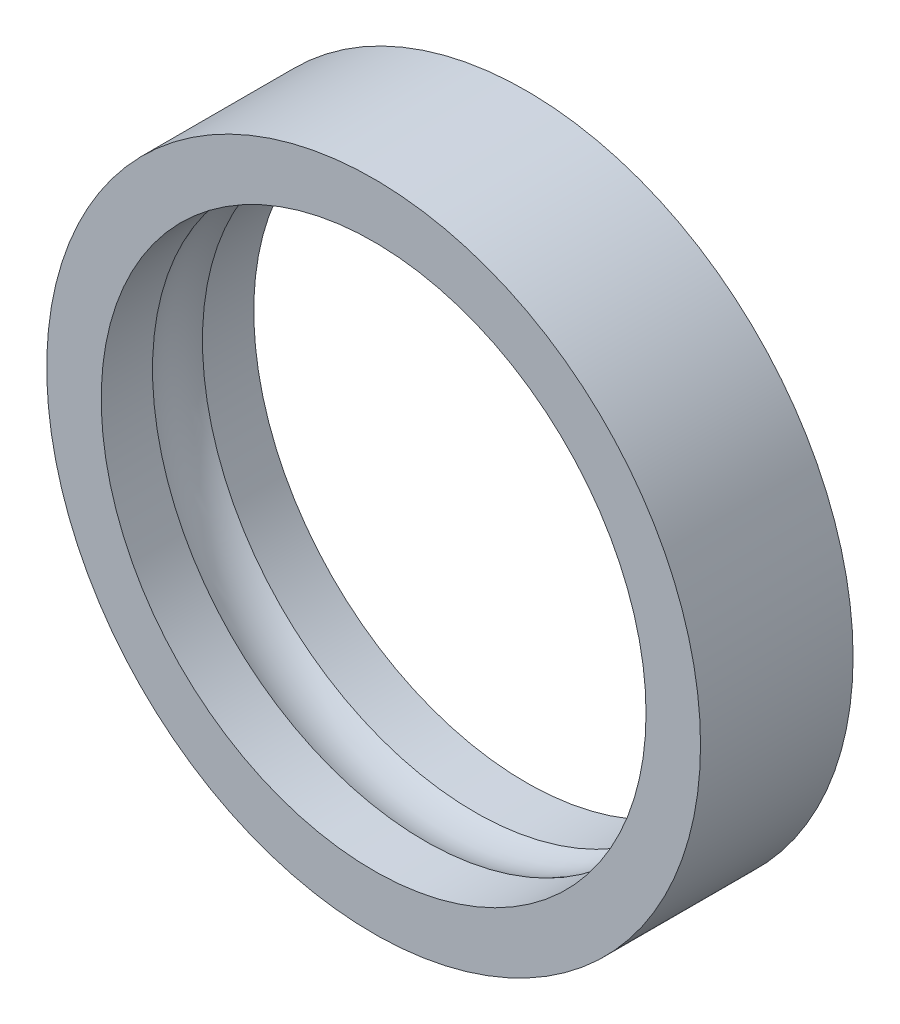
ISO-10303-21;
HEADER;
FILE_DESCRIPTION(('STEP AP214'),'2;1');
FILE_NAME('part.step','',(''),(''),'','','');
FILE_SCHEMA(('AUTOMOTIVE_DESIGN { 1 0 10303 214 1 1 1 1 }'));
ENDSEC;
DATA;
#1=APPLICATION_CONTEXT('core data for automotive mechanical design processes');
#2=APPLICATION_PROTOCOL_DEFINITION('international standard','automotive_design',2000,#1);
#3=PRODUCT_CONTEXT('',#1,'mechanical');
#4=PRODUCT('Part','Part','',(#3));
#5=PRODUCT_RELATED_PRODUCT_CATEGORY('part','',(#4));
#6=PRODUCT_DEFINITION_FORMATION('','',#4);
#7=PRODUCT_DEFINITION_CONTEXT('part definition',#1,'design');
#8=PRODUCT_DEFINITION('design','',#6,#7);
#9=PRODUCT_DEFINITION_SHAPE('','',#8);
#10=(LENGTH_UNIT() NAMED_UNIT(*) SI_UNIT(.MILLI.,.METRE.));
#11=(NAMED_UNIT(*) PLANE_ANGLE_UNIT() SI_UNIT($,.RADIAN.));
#12=(NAMED_UNIT(*) SI_UNIT($,.STERADIAN.) SOLID_ANGLE_UNIT());
#13=UNCERTAINTY_MEASURE_WITH_UNIT(LENGTH_MEASURE(1.E-05),#10,'distance_accuracy_value','');
#14=(GEOMETRIC_REPRESENTATION_CONTEXT(3) GLOBAL_UNCERTAINTY_ASSIGNED_CONTEXT((#13)) GLOBAL_UNIT_ASSIGNED_CONTEXT((#10,
#11,#12)) REPRESENTATION_CONTEXT('',''));
#15=CARTESIAN_POINT('',(0.,0.,0.));
#16=DIRECTION('',(0.,0.,1.));
#17=DIRECTION('',(1.,0.,0.));
#18=AXIS2_PLACEMENT_3D('',#15,#16,#17);
#19=CARTESIAN_POINT('',(0.,0.,0.));
#20=DIRECTION('',(0.,0.,1.));
#21=DIRECTION('',(1.,0.,0.));
#22=AXIS2_PLACEMENT_3D('',#19,#20,#21);
#23=TOROIDAL_SURFACE('',#22,20.,5.5);
#24=CARTESIAN_POINT('',(0.,0.,2.29128784747792));
#25=DIRECTION('',(0.,0.,1.));
#26=DIRECTION('',(1.,0.,0.));
#27=AXIS2_PLACEMENT_3D('',#24,#25,#26);
#28=CIRCLE('',#27,25.);
#29=CARTESIAN_POINT('',(25.,0.,2.29128784747792));
#30=VERTEX_POINT('',#29);
#31=EDGE_CURVE('E37',#30,#30,#28,.T.);
#32=ORIENTED_EDGE('',*,*,#31,.T.);
#33=EDGE_LOOP('',(#32));
#34=FACE_BOUND('',#33,.T.);
#35=CARTESIAN_POINT('',(0.,0.,-2.29128784747792));
#36=DIRECTION('',(0.,0.,1.));
#37=DIRECTION('',(1.,0.,0.));
#38=AXIS2_PLACEMENT_3D('',#35,#36,#37);
#39=CIRCLE('',#38,25.);
#40=CARTESIAN_POINT('',(25.,0.,-2.29128784747792));
#41=VERTEX_POINT('',#40);
#42=EDGE_CURVE('E31',#41,#41,#39,.F.);
#43=ORIENTED_EDGE('',*,*,#42,.T.);
#44=EDGE_LOOP('',(#43));
#45=FACE_BOUND('',#44,.T.);
#46=ADVANCED_FACE('F15',(#34,#45),#23,.F.);
#47=CARTESIAN_POINT('',(0.,0.,-7.));
#48=DIRECTION('',(0.,0.,1.));
#49=DIRECTION('',(1.,0.,0.));
#50=AXIS2_PLACEMENT_3D('',#47,#48,#49);
#51=CYLINDRICAL_SURFACE('',#50,25.);
#52=CARTESIAN_POINT('',(0.,0.,-7.));
#53=DIRECTION('',(0.,0.,1.));
#54=DIRECTION('',(1.,0.,0.));
#55=AXIS2_PLACEMENT_3D('',#52,#53,#54);
#56=CIRCLE('',#55,25.);
#57=CARTESIAN_POINT('',(25.,0.,-7.));
#58=VERTEX_POINT('',#57);
#59=EDGE_CURVE('E19',#58,#58,#56,.F.);
#60=ORIENTED_EDGE('',*,*,#59,.T.);
#61=EDGE_LOOP('',(#60));
#62=FACE_BOUND('',#61,.T.);
#63=ORIENTED_EDGE('',*,*,#42,.F.);
#64=EDGE_LOOP('',(#63));
#65=FACE_BOUND('',#64,.T.);
#66=ADVANCED_FACE('F48',(#62,#65),#51,.F.);
#67=CARTESIAN_POINT('',(0.,0.,-7.));
#68=DIRECTION('',(0.,0.,1.));
#69=DIRECTION('',(1.,0.,0.));
#70=AXIS2_PLACEMENT_3D('',#67,#68,#69);
#71=CYLINDRICAL_SURFACE('',#70,25.);
#72=CARTESIAN_POINT('',(0.,0.,7.));
#73=DIRECTION('',(0.,0.,1.));
#74=DIRECTION('',(1.,0.,0.));
#75=AXIS2_PLACEMENT_3D('',#72,#73,#74);
#76=CIRCLE('',#75,25.);
#77=CARTESIAN_POINT('',(25.,0.,7.));
#78=VERTEX_POINT('',#77);
#79=EDGE_CURVE('E28',#78,#78,#76,.F.);
#80=ORIENTED_EDGE('',*,*,#79,.F.);
#81=EDGE_LOOP('',(#80));
#82=FACE_BOUND('',#81,.T.);
#83=ORIENTED_EDGE('',*,*,#31,.F.);
#84=EDGE_LOOP('',(#83));
#85=FACE_BOUND('',#84,.T.);
#86=ADVANCED_FACE('F50',(#82,#85),#71,.F.);
#87=CARTESIAN_POINT('',(0.,0.,-7.));
#88=DIRECTION('',(0.,0.,1.));
#89=DIRECTION('',(1.,0.,0.));
#90=AXIS2_PLACEMENT_3D('',#87,#88,#89);
#91=PLANE('',#90);
#92=CARTESIAN_POINT('',(0.,0.,-7.));
#93=DIRECTION('',(0.,0.,1.));
#94=DIRECTION('',(1.,0.,0.));
#95=AXIS2_PLACEMENT_3D('',#92,#93,#94);
#96=CIRCLE('',#95,30.);
#97=CARTESIAN_POINT('',(30.,0.,-7.));
#98=VERTEX_POINT('',#97);
#99=EDGE_CURVE('E23',#98,#98,#96,.T.);
#100=ORIENTED_EDGE('',*,*,#99,.F.);
#101=EDGE_LOOP('',(#100));
#102=FACE_BOUND('',#101,.T.);
#103=ORIENTED_EDGE('',*,*,#59,.F.);
#104=EDGE_LOOP('',(#103));
#105=FACE_BOUND('',#104,.T.);
#106=ADVANCED_FACE('F56',(#102,#105),#91,.F.);
#107=CARTESIAN_POINT('',(0.,0.,7.));
#108=DIRECTION('',(0.,0.,1.));
#109=DIRECTION('',(1.,0.,0.));
#110=AXIS2_PLACEMENT_3D('',#107,#108,#109);
#111=PLANE('',#110);
#112=ORIENTED_EDGE('',*,*,#79,.T.);
#113=EDGE_LOOP('',(#112));
#114=FACE_BOUND('',#113,.T.);
#115=CARTESIAN_POINT('',(0.,0.,7.));
#116=DIRECTION('',(0.,0.,1.));
#117=DIRECTION('',(1.,0.,0.));
#118=AXIS2_PLACEMENT_3D('',#115,#116,#117);
#119=CIRCLE('',#118,30.);
#120=CARTESIAN_POINT('',(30.,0.,7.));
#121=VERTEX_POINT('',#120);
#122=EDGE_CURVE('E10',#121,#121,#119,.F.);
#123=ORIENTED_EDGE('',*,*,#122,.F.);
#124=EDGE_LOOP('',(#123));
#125=FACE_BOUND('',#124,.T.);
#126=ADVANCED_FACE('F61',(#114,#125),#111,.T.);
#127=CARTESIAN_POINT('',(0.,0.,-7.));
#128=DIRECTION('',(0.,0.,1.));
#129=DIRECTION('',(1.,0.,0.));
#130=AXIS2_PLACEMENT_3D('',#127,#128,#129);
#131=CYLINDRICAL_SURFACE('',#130,30.);
#132=ORIENTED_EDGE('',*,*,#122,.T.);
#133=EDGE_LOOP('',(#132));
#134=FACE_BOUND('',#133,.T.);
#135=ORIENTED_EDGE('',*,*,#99,.T.);
#136=EDGE_LOOP('',(#135));
#137=FACE_BOUND('',#136,.T.);
#138=ADVANCED_FACE('F59',(#134,#137),#131,.T.);
#139=CLOSED_SHELL('',(#46,#66,#86,#106,#126,#138));
#140=MANIFOLD_SOLID_BREP('B1',#139);
#141=ADVANCED_BREP_SHAPE_REPRESENTATION('',(#18,#140),#14);
#142=SHAPE_DEFINITION_REPRESENTATION(#9,#141);
ENDSEC;
END-ISO-10303-21;
